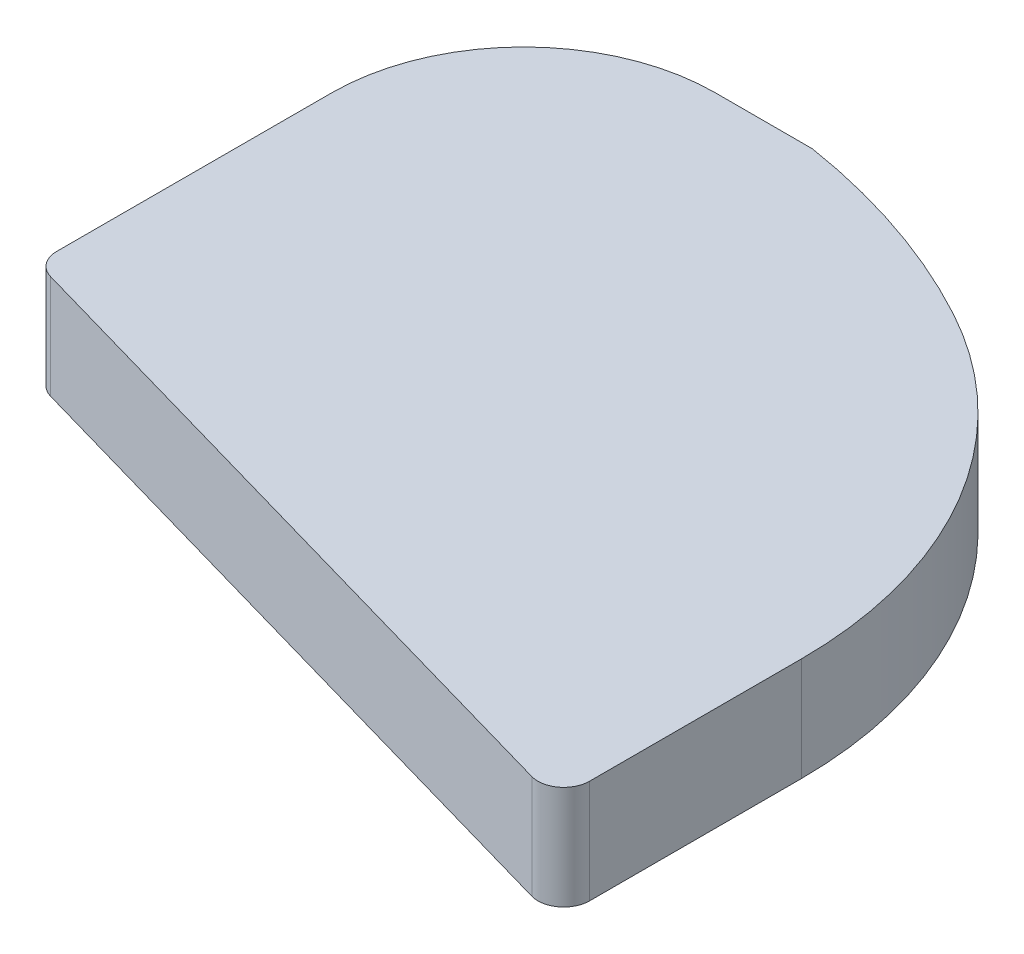
ISO-10303-21;
HEADER;
FILE_DESCRIPTION(('STEP AP214'),'2;1');
FILE_NAME('part.step','',(''),(''),'','','');
FILE_SCHEMA(('AUTOMOTIVE_DESIGN { 1 0 10303 214 1 1 1 1 }'));
ENDSEC;
DATA;
#1=APPLICATION_CONTEXT('core data for automotive mechanical design processes');
#2=APPLICATION_PROTOCOL_DEFINITION('international standard','automotive_design',2000,#1);
#3=PRODUCT_CONTEXT('',#1,'mechanical');
#4=PRODUCT('Part','Part','',(#3));
#5=PRODUCT_RELATED_PRODUCT_CATEGORY('part','',(#4));
#6=PRODUCT_DEFINITION_FORMATION('','',#4);
#7=PRODUCT_DEFINITION_CONTEXT('part definition',#1,'design');
#8=PRODUCT_DEFINITION('design','',#6,#7);
#9=PRODUCT_DEFINITION_SHAPE('','',#8);
#10=(LENGTH_UNIT() NAMED_UNIT(*) SI_UNIT(.MILLI.,.METRE.));
#11=(NAMED_UNIT(*) PLANE_ANGLE_UNIT() SI_UNIT($,.RADIAN.));
#12=(NAMED_UNIT(*) SI_UNIT($,.STERADIAN.) SOLID_ANGLE_UNIT());
#13=UNCERTAINTY_MEASURE_WITH_UNIT(LENGTH_MEASURE(1.E-05),#10,'distance_accuracy_value','');
#14=(GEOMETRIC_REPRESENTATION_CONTEXT(3) GLOBAL_UNCERTAINTY_ASSIGNED_CONTEXT((#13)) GLOBAL_UNIT_ASSIGNED_CONTEXT((#10,
#11,#12)) REPRESENTATION_CONTEXT('',''));
#15=CARTESIAN_POINT('',(0.,0.,0.));
#16=DIRECTION('',(0.,0.,1.));
#17=DIRECTION('',(1.,0.,0.));
#18=AXIS2_PLACEMENT_3D('',#15,#16,#17);
#19=CARTESIAN_POINT('',(-0.536743258831419,2.9956,1.0642326343214));
#20=DIRECTION('',(0.,-1.,0.));
#21=DIRECTION('',(-1.,0.,0.));
#22=AXIS2_PLACEMENT_3D('',#19,#20,#21);
#23=CYLINDRICAL_SURFACE('',#22,0.0162162162161816);
#24=CARTESIAN_POINT('',(-0.536743258831419,2.9956,1.0642326343214));
#25=DIRECTION('',(0.,1.,0.));
#26=DIRECTION('',(1.,0.,0.));
#27=AXIS2_PLACEMENT_3D('',#24,#25,#26);
#28=CIRCLE('',#27,0.0162162162161816);
#29=CARTESIAN_POINT('',(-0.552959475047601,2.9956,1.0642326343214));
#30=VERTEX_POINT('',#29);
#31=CARTESIAN_POINT('',(-0.541196318347263,2.9956,1.0798254509149));
#32=VERTEX_POINT('',#31);
#33=EDGE_CURVE('E11',#30,#32,#28,.T.);
#34=ORIENTED_EDGE('',*,*,#33,.F.);
#35=DIRECTION('',(0.,-1.,0.));
#36=VECTOR('',#35,1.);
#37=CARTESIAN_POINT('',(-0.552959475047601,2.9956,1.0642326343214));
#38=LINE('',#37,#36);
#39=CARTESIAN_POINT('',(-0.552959475047601,2.9306,1.0642326343214));
#40=VERTEX_POINT('',#39);
#41=EDGE_CURVE('E24',#30,#40,#38,.T.);
#42=ORIENTED_EDGE('',*,*,#41,.T.);
#43=CARTESIAN_POINT('',(-0.536743258831419,2.9306,1.0642326343214));
#44=DIRECTION('',(0.,1.,0.));
#45=DIRECTION('',(1.,0.,0.));
#46=AXIS2_PLACEMENT_3D('',#43,#44,#45);
#47=CIRCLE('',#46,0.0162162162161816);
#48=CARTESIAN_POINT('',(-0.541196318347263,2.9306,1.0798254509149));
#49=VERTEX_POINT('',#48);
#50=EDGE_CURVE('E170',#40,#49,#47,.T.);
#51=ORIENTED_EDGE('',*,*,#50,.T.);
#52=DIRECTION('',(0.,-1.,0.));
#53=VECTOR('',#52,1.);
#54=CARTESIAN_POINT('',(-0.541196318347263,2.9956,1.0798254509149));
#55=LINE('',#54,#53);
#56=EDGE_CURVE('E167',#32,#49,#55,.T.);
#57=ORIENTED_EDGE('',*,*,#56,.F.);
#58=EDGE_LOOP('',(#34,#42,#51,#57));
#59=FACE_BOUND('',#58,.T.);
#60=ADVANCED_FACE('F17',(#59),#23,.T.);
#61=CARTESIAN_POINT('',(-0.536743258831419,2.9956,1.0642326343214));
#62=DIRECTION('',(0.,-1.,0.));
#63=DIRECTION('',(-1.,0.,0.));
#64=AXIS2_PLACEMENT_3D('',#61,#62,#63);
#65=CYLINDRICAL_SURFACE('',#64,0.0162162162161816);
#66=ORIENTED_EDGE('',*,*,#41,.F.);
#67=CARTESIAN_POINT('',(-0.536743258831419,2.9956,1.0642326343214));
#68=DIRECTION('',(0.,1.,0.));
#69=DIRECTION('',(1.,0.,0.));
#70=AXIS2_PLACEMENT_3D('',#67,#68,#69);
#71=CIRCLE('',#70,0.0162162162161816);
#72=CARTESIAN_POINT('',(-0.552959471500275,2.9956,1.0642219082597));
#73=VERTEX_POINT('',#72);
#74=EDGE_CURVE('E165',#73,#30,#71,.T.);
#75=ORIENTED_EDGE('',*,*,#74,.F.);
#76=DIRECTION('',(0.,-1.,0.));
#77=VECTOR('',#76,1.);
#78=CARTESIAN_POINT('',(-0.552959471500275,2.9956,1.0642219082597));
#79=LINE('',#78,#77);
#80=CARTESIAN_POINT('',(-0.552959471500275,2.9306,1.0642219082597));
#81=VERTEX_POINT('',#80);
#82=EDGE_CURVE('E113',#73,#81,#79,.T.);
#83=ORIENTED_EDGE('',*,*,#82,.T.);
#84=CARTESIAN_POINT('',(-0.536743258831419,2.9306,1.0642326343214));
#85=DIRECTION('',(0.,1.,0.));
#86=DIRECTION('',(1.,0.,0.));
#87=AXIS2_PLACEMENT_3D('',#84,#85,#86);
#88=CIRCLE('',#87,0.0162162162161816);
#89=EDGE_CURVE('E161',#81,#40,#88,.T.);
#90=ORIENTED_EDGE('',*,*,#89,.T.);
#91=EDGE_LOOP('',(#66,#75,#83,#90));
#92=FACE_BOUND('',#91,.T.);
#93=ADVANCED_FACE('F178',(#92),#65,.T.);
#94=CARTESIAN_POINT('',(-0.541196318347263,2.9956,1.0798254509149));
#95=DIRECTION('',(0.274605336809778,0.,-0.961557023267777));
#96=DIRECTION('',(-0.961557023267777,0.,-0.274605336809778));
#97=AXIS2_PLACEMENT_3D('',#94,#95,#96);
#98=PLANE('',#97);
#99=DIRECTION('',(0.961557023267777,0.,0.274605336809778));
#100=VECTOR('',#99,1.);
#101=CARTESIAN_POINT('',(-0.541196318347263,2.9306,1.0798254509149));
#102=LINE('',#101,#100);
#103=CARTESIAN_POINT('',(-0.118870607161554,2.9306,1.2004349325756));
#104=VERTEX_POINT('',#103);
#105=EDGE_CURVE('E159',#49,#104,#102,.T.);
#106=ORIENTED_EDGE('',*,*,#105,.T.);
#107=DIRECTION('',(0.,-1.,0.));
#108=VECTOR('',#107,1.);
#109=CARTESIAN_POINT('',(-0.118870607161554,2.9956,1.2004349325756));
#110=LINE('',#109,#108);
#111=CARTESIAN_POINT('',(-0.118870607161554,2.9956,1.2004349325756));
#112=VERTEX_POINT('',#111);
#113=EDGE_CURVE('E156',#112,#104,#110,.T.);
#114=ORIENTED_EDGE('',*,*,#113,.F.);
#115=DIRECTION('',(0.961557023267777,0.,0.274605336809778));
#116=VECTOR('',#115,1.);
#117=CARTESIAN_POINT('',(-0.541196318347263,2.9956,1.0798254509149));
#118=LINE('',#117,#116);
#119=EDGE_CURVE('E154',#32,#112,#118,.T.);
#120=ORIENTED_EDGE('',*,*,#119,.F.);
#121=ORIENTED_EDGE('',*,*,#56,.T.);
#122=EDGE_LOOP('',(#106,#114,#120,#121));
#123=FACE_BOUND('',#122,.T.);
#124=ADVANCED_FACE('F180',(#123),#98,.F.);
#125=CARTESIAN_POINT('',(-0.114417547645754,2.9956,1.1848421159821));
#126=DIRECTION('',(0.,-1.,0.));
#127=DIRECTION('',(-1.,0.,0.));
#128=AXIS2_PLACEMENT_3D('',#125,#126,#127);
#129=CYLINDRICAL_SURFACE('',#128,0.0162162162162017);
#130=CARTESIAN_POINT('',(-0.114417547645754,2.9306,1.1848421159821));
#131=DIRECTION('',(0.,1.,0.));
#132=DIRECTION('',(1.,0.,0.));
#133=AXIS2_PLACEMENT_3D('',#130,#131,#132);
#134=CIRCLE('',#133,0.0162162162162017);
#135=CARTESIAN_POINT('',(-0.098201331429552,2.9306,1.1848421159821));
#136=VERTEX_POINT('',#135);
#137=EDGE_CURVE('E152',#104,#136,#134,.T.);
#138=ORIENTED_EDGE('',*,*,#137,.T.);
#139=DIRECTION('',(0.,-1.,0.));
#140=VECTOR('',#139,1.);
#141=CARTESIAN_POINT('',(-0.098201331429552,2.9956,1.1848421159821));
#142=LINE('',#141,#140);
#143=CARTESIAN_POINT('',(-0.098201331429552,2.9956,1.1848421159821));
#144=VERTEX_POINT('',#143);
#145=EDGE_CURVE('E149',#144,#136,#142,.T.);
#146=ORIENTED_EDGE('',*,*,#145,.F.);
#147=CARTESIAN_POINT('',(-0.114417547645754,2.9956,1.1848421159821));
#148=DIRECTION('',(0.,1.,0.));
#149=DIRECTION('',(1.,0.,0.));
#150=AXIS2_PLACEMENT_3D('',#147,#148,#149);
#151=CIRCLE('',#150,0.0162162162162017);
#152=EDGE_CURVE('E146',#112,#144,#151,.T.);
#153=ORIENTED_EDGE('',*,*,#152,.F.);
#154=ORIENTED_EDGE('',*,*,#113,.T.);
#155=EDGE_LOOP('',(#138,#146,#153,#154));
#156=FACE_BOUND('',#155,.T.);
#157=ADVANCED_FACE('F186',(#156),#129,.T.);
#158=CARTESIAN_POINT('',(-0.0982013314295497,2.9956,1.1848421159821));
#159=DIRECTION('',(-1.,0.,0.));
#160=DIRECTION('',(0.,1.,0.));
#161=AXIS2_PLACEMENT_3D('',#158,#159,#160);
#162=PLANE('',#161);
#163=DIRECTION('',(0.,0.,-1.));
#164=VECTOR('',#163,1.);
#165=CARTESIAN_POINT('',(-0.0982013314295497,2.9306,1.1848421159821));
#166=LINE('',#165,#164);
#167=CARTESIAN_POINT('',(-0.0982013314295497,2.9306,1.0521233041799));
#168=VERTEX_POINT('',#167);
#169=EDGE_CURVE('E144',#136,#168,#166,.T.);
#170=ORIENTED_EDGE('',*,*,#169,.T.);
#171=DIRECTION('',(0.,-1.,0.));
#172=VECTOR('',#171,1.);
#173=CARTESIAN_POINT('',(-0.0982013314295497,2.9956,1.0521233041799));
#174=LINE('',#173,#172);
#175=CARTESIAN_POINT('',(-0.0982013314295497,2.9956,1.0521233041799));
#176=VERTEX_POINT('',#175);
#177=EDGE_CURVE('E141',#176,#168,#174,.T.);
#178=ORIENTED_EDGE('',*,*,#177,.F.);
#179=DIRECTION('',(0.,0.,-1.));
#180=VECTOR('',#179,1.);
#181=CARTESIAN_POINT('',(-0.0982013314295497,2.9956,1.1848421159821));
#182=LINE('',#181,#180);
#183=EDGE_CURVE('E138',#144,#176,#182,.T.);
#184=ORIENTED_EDGE('',*,*,#183,.F.);
#185=ORIENTED_EDGE('',*,*,#145,.T.);
#186=EDGE_LOOP('',(#170,#178,#184,#185));
#187=FACE_BOUND('',#186,.T.);
#188=ADVANCED_FACE('F192',(#187),#162,.F.);
#189=CARTESIAN_POINT('',(-0.365790941531708,2.9956,1.0521233041789));
#190=DIRECTION('',(0.,-1.,0.));
#191=DIRECTION('',(-1.,0.,0.));
#192=AXIS2_PLACEMENT_3D('',#189,#190,#191);
#193=CYLINDRICAL_SURFACE('',#192,0.267589610102158);
#194=CARTESIAN_POINT('',(-0.365790941531708,2.9306,1.0521233041789));
#195=DIRECTION('',(0.,1.,0.));
#196=DIRECTION('',(1.,0.,0.));
#197=AXIS2_PLACEMENT_3D('',#194,#195,#196);
#198=CIRCLE('',#197,0.267589610102158);
#199=CARTESIAN_POINT('',(-0.238035683733529,2.9306,0.817000371355327));
#200=VERTEX_POINT('',#199);
#201=EDGE_CURVE('E136',#168,#200,#198,.T.);
#202=ORIENTED_EDGE('',*,*,#201,.T.);
#203=DIRECTION('',(0.,-1.,0.));
#204=VECTOR('',#203,1.);
#205=CARTESIAN_POINT('',(-0.238035683733529,2.9956,0.817000371355327));
#206=LINE('',#205,#204);
#207=CARTESIAN_POINT('',(-0.238035683733529,2.9956,0.817000371355327));
#208=VERTEX_POINT('',#207);
#209=EDGE_CURVE('E133',#208,#200,#206,.T.);
#210=ORIENTED_EDGE('',*,*,#209,.F.);
#211=CARTESIAN_POINT('',(-0.365790941531708,2.9956,1.0521233041789));
#212=DIRECTION('',(0.,1.,0.));
#213=DIRECTION('',(1.,0.,0.));
#214=AXIS2_PLACEMENT_3D('',#211,#212,#213);
#215=CIRCLE('',#214,0.267589610102158);
#216=EDGE_CURVE('E130',#176,#208,#215,.T.);
#217=ORIENTED_EDGE('',*,*,#216,.F.);
#218=ORIENTED_EDGE('',*,*,#177,.T.);
#219=EDGE_LOOP('',(#202,#210,#217,#218));
#220=FACE_BOUND('',#219,.T.);
#221=ADVANCED_FACE('F196',(#220),#193,.T.);
#222=CARTESIAN_POINT('',(-0.436916741820405,2.9956,1.1830244275585));
#223=DIRECTION('',(0.,-1.,0.));
#224=DIRECTION('',(-1.,0.,0.));
#225=AXIS2_PLACEMENT_3D('',#222,#223,#224);
#226=CYLINDRICAL_SURFACE('',#225,0.416566063170274);
#227=CARTESIAN_POINT('',(-0.436916741820405,2.9306,1.1830244275585));
#228=DIRECTION('',(0.,1.,0.));
#229=DIRECTION('',(1.,0.,0.));
#230=AXIS2_PLACEMENT_3D('',#227,#228,#229);
#231=CIRCLE('',#230,0.416566063170274);
#232=CARTESIAN_POINT('',(-0.371695539348453,2.9306,0.771595843557231));
#233=VERTEX_POINT('',#232);
#234=EDGE_CURVE('E128',#200,#233,#231,.T.);
#235=ORIENTED_EDGE('',*,*,#234,.T.);
#236=DIRECTION('',(0.,-1.,0.));
#237=VECTOR('',#236,1.);
#238=CARTESIAN_POINT('',(-0.371695539348453,2.9956,0.771595843557231));
#239=LINE('',#238,#237);
#240=CARTESIAN_POINT('',(-0.371695539348453,2.9956,0.771595843557231));
#241=VERTEX_POINT('',#240);
#242=EDGE_CURVE('E125',#241,#233,#239,.T.);
#243=ORIENTED_EDGE('',*,*,#242,.F.);
#244=CARTESIAN_POINT('',(-0.436916741820405,2.9956,1.1830244275585));
#245=DIRECTION('',(0.,1.,0.));
#246=DIRECTION('',(1.,0.,0.));
#247=AXIS2_PLACEMENT_3D('',#244,#245,#246);
#248=CIRCLE('',#247,0.416566063170274);
#249=EDGE_CURVE('E123',#208,#241,#248,.T.);
#250=ORIENTED_EDGE('',*,*,#249,.F.);
#251=ORIENTED_EDGE('',*,*,#209,.T.);
#252=EDGE_LOOP('',(#235,#243,#250,#251));
#253=FACE_BOUND('',#252,.T.);
#254=ADVANCED_FACE('F200',(#253),#226,.T.);
#255=CARTESIAN_POINT('',(-0.371695539348453,2.9956,0.771595843557232));
#256=DIRECTION('',(0.,0.,1.));
#257=DIRECTION('',(0.,-1.,0.));
#258=AXIS2_PLACEMENT_3D('',#255,#256,#257);
#259=PLANE('',#258);
#260=DIRECTION('',(-1.,0.,0.));
#261=VECTOR('',#260,1.);
#262=CARTESIAN_POINT('',(-0.371695539348453,2.9306,0.771595843557232));
#263=LINE('',#262,#261);
#264=CARTESIAN_POINT('',(-0.43252115348625,2.9306,0.771595843557232));
#265=VERTEX_POINT('',#264);
#266=EDGE_CURVE('E121',#233,#265,#263,.T.);
#267=ORIENTED_EDGE('',*,*,#266,.T.);
#268=DIRECTION('',(0.,-1.,0.));
#269=VECTOR('',#268,1.);
#270=CARTESIAN_POINT('',(-0.43252115348625,2.9956,0.771595843557232));
#271=LINE('',#270,#269);
#272=CARTESIAN_POINT('',(-0.43252115348625,2.9956,0.771595843557232));
#273=VERTEX_POINT('',#272);
#274=EDGE_CURVE('E119',#273,#265,#271,.T.);
#275=ORIENTED_EDGE('',*,*,#274,.F.);
#276=DIRECTION('',(-1.,0.,0.));
#277=VECTOR('',#276,1.);
#278=CARTESIAN_POINT('',(-0.371695539348453,2.9956,0.771595843557232));
#279=LINE('',#278,#277);
#280=EDGE_CURVE('E108',#241,#273,#279,.T.);
#281=ORIENTED_EDGE('',*,*,#280,.F.);
#282=ORIENTED_EDGE('',*,*,#242,.T.);
#283=EDGE_LOOP('',(#267,#275,#281,#282));
#284=FACE_BOUND('',#283,.T.);
#285=ADVANCED_FACE('F204',(#284),#259,.F.);
#286=CARTESIAN_POINT('',(-0.43252115348626,2.9956,0.891920167881548));
#287=DIRECTION('',(0.,-1.,0.));
#288=DIRECTION('',(-1.,0.,0.));
#289=AXIS2_PLACEMENT_3D('',#286,#287,#288);
#290=CYLINDRICAL_SURFACE('',#289,0.120324324324316);
#291=CARTESIAN_POINT('',(-0.43252115348626,2.9306,0.891920167881548));
#292=DIRECTION('',(0.,1.,0.));
#293=DIRECTION('',(1.,0.,0.));
#294=AXIS2_PLACEMENT_3D('',#291,#292,#293);
#295=CIRCLE('',#294,0.120324324324316);
#296=CARTESIAN_POINT('',(-0.552845451489418,2.9306,0.891840580504245));
#297=VERTEX_POINT('',#296);
#298=EDGE_CURVE('E96',#265,#297,#295,.T.);
#299=ORIENTED_EDGE('',*,*,#298,.T.);
#300=DIRECTION('',(0.,-1.,0.));
#301=VECTOR('',#300,1.);
#302=CARTESIAN_POINT('',(-0.552845451489418,2.9956,0.891840580504245));
#303=LINE('',#302,#301);
#304=CARTESIAN_POINT('',(-0.552845451489418,2.9956,0.891840580504245));
#305=VERTEX_POINT('',#304);
#306=EDGE_CURVE('E90',#305,#297,#303,.T.);
#307=ORIENTED_EDGE('',*,*,#306,.F.);
#308=CARTESIAN_POINT('',(-0.43252115348626,2.9956,0.891920167881548));
#309=DIRECTION('',(0.,1.,0.));
#310=DIRECTION('',(1.,0.,0.));
#311=AXIS2_PLACEMENT_3D('',#308,#309,#310);
#312=CIRCLE('',#311,0.120324324324316);
#313=EDGE_CURVE('E94',#273,#305,#312,.T.);
#314=ORIENTED_EDGE('',*,*,#313,.F.);
#315=ORIENTED_EDGE('',*,*,#274,.T.);
#316=EDGE_LOOP('',(#299,#307,#314,#315));
#317=FACE_BOUND('',#316,.T.);
#318=ADVANCED_FACE('F92',(#317),#290,.T.);
#319=CARTESIAN_POINT('',(-0.552845451489419,2.9956,0.891840580504245));
#320=DIRECTION('',(0.999999781248231,0.,0.000661440466894362));
#321=DIRECTION('',(0.000661440466894362,0.,-0.999999781248231));
#322=AXIS2_PLACEMENT_3D('',#319,#320,#321);
#323=PLANE('',#322);
#324=DIRECTION('',(-0.000661440466894362,0.,0.99999978124823));
#325=VECTOR('',#324,1.);
#326=CARTESIAN_POINT('',(-0.552845451489419,2.9306,0.891840580504245));
#327=LINE('',#326,#325);
#328=EDGE_CURVE('E109',#297,#81,#327,.T.);
#329=ORIENTED_EDGE('',*,*,#328,.T.);
#330=ORIENTED_EDGE('',*,*,#82,.F.);
#331=DIRECTION('',(-0.000661440466894362,0.,0.99999978124823));
#332=VECTOR('',#331,1.);
#333=CARTESIAN_POINT('',(-0.552845451489419,2.9956,0.891840580504245));
#334=LINE('',#333,#332);
#335=EDGE_CURVE('E105',#305,#73,#334,.T.);
#336=ORIENTED_EDGE('',*,*,#335,.F.);
#337=ORIENTED_EDGE('',*,*,#306,.T.);
#338=EDGE_LOOP('',(#329,#330,#336,#337));
#339=FACE_BOUND('',#338,.T.);
#340=ADVANCED_FACE('F112',(#339),#323,.F.);
#341=CARTESIAN_POINT('',(-0.536743258831419,2.9956,1.0642326343214));
#342=DIRECTION('',(0.,1.,0.));
#343=DIRECTION('',(1.,0.,0.));
#344=AXIS2_PLACEMENT_3D('',#341,#342,#343);
#345=PLANE('',#344);
#346=ORIENTED_EDGE('',*,*,#74,.T.);
#347=ORIENTED_EDGE('',*,*,#33,.T.);
#348=ORIENTED_EDGE('',*,*,#119,.T.);
#349=ORIENTED_EDGE('',*,*,#152,.T.);
#350=ORIENTED_EDGE('',*,*,#183,.T.);
#351=ORIENTED_EDGE('',*,*,#216,.T.);
#352=ORIENTED_EDGE('',*,*,#249,.T.);
#353=ORIENTED_EDGE('',*,*,#280,.T.);
#354=ORIENTED_EDGE('',*,*,#313,.T.);
#355=ORIENTED_EDGE('',*,*,#335,.T.);
#356=EDGE_LOOP('',(#346,#347,#348,#349,#350,#351,#352,#353,#354,#355));
#357=FACE_BOUND('',#356,.T.);
#358=ADVANCED_FACE('F104',(#357),#345,.T.);
#359=CARTESIAN_POINT('',(-0.536743258831419,2.9306,1.0642326343214));
#360=DIRECTION('',(0.,1.,0.));
#361=DIRECTION('',(1.,0.,0.));
#362=AXIS2_PLACEMENT_3D('',#359,#360,#361);
#363=PLANE('',#362);
#364=ORIENTED_EDGE('',*,*,#89,.F.);
#365=ORIENTED_EDGE('',*,*,#328,.F.);
#366=ORIENTED_EDGE('',*,*,#298,.F.);
#367=ORIENTED_EDGE('',*,*,#266,.F.);
#368=ORIENTED_EDGE('',*,*,#234,.F.);
#369=ORIENTED_EDGE('',*,*,#201,.F.);
#370=ORIENTED_EDGE('',*,*,#169,.F.);
#371=ORIENTED_EDGE('',*,*,#137,.F.);
#372=ORIENTED_EDGE('',*,*,#105,.F.);
#373=ORIENTED_EDGE('',*,*,#50,.F.);
#374=EDGE_LOOP('',(#364,#365,#366,#367,#368,#369,#370,#371,#372,#373));
#375=FACE_BOUND('',#374,.T.);
#376=ADVANCED_FACE('F176',(#375),#363,.F.);
#377=CLOSED_SHELL('',(#60,#93,#124,#157,#188,#221,#254,#285,#318,#340,#358,#376));
#378=MANIFOLD_SOLID_BREP('B1',#377);
#379=ADVANCED_BREP_SHAPE_REPRESENTATION('',(#18,#378),#14);
#380=SHAPE_DEFINITION_REPRESENTATION(#9,#379);
ENDSEC;
END-ISO-10303-21;
